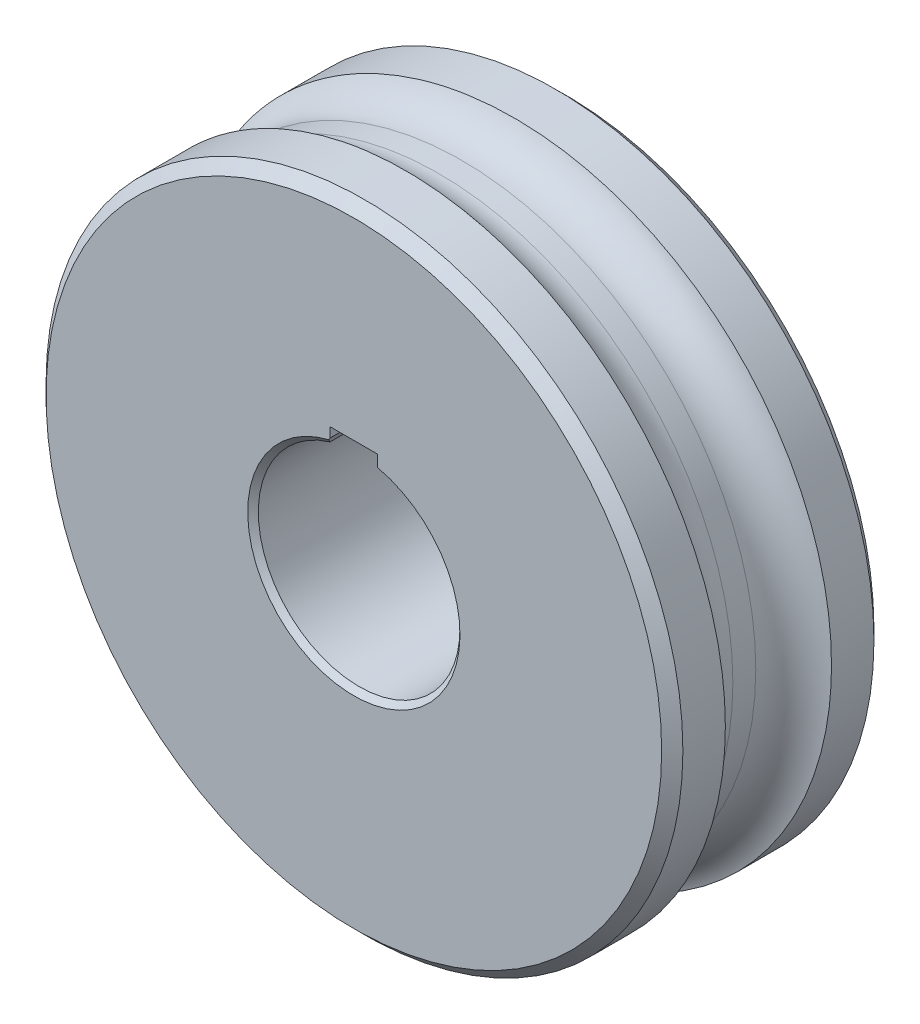
ISO-10303-21;
HEADER;
FILE_DESCRIPTION(('STEP AP214'),'2;1');
FILE_NAME('part.step','',(''),(''),'','','');
FILE_SCHEMA(('AUTOMOTIVE_DESIGN { 1 0 10303 214 1 1 1 1 }'));
ENDSEC;
DATA;
#1=APPLICATION_CONTEXT('core data for automotive mechanical design processes');
#2=APPLICATION_PROTOCOL_DEFINITION('international standard','automotive_design',2000,#1);
#3=PRODUCT_CONTEXT('',#1,'mechanical');
#4=PRODUCT('Part','Part','',(#3));
#5=PRODUCT_RELATED_PRODUCT_CATEGORY('part','',(#4));
#6=PRODUCT_DEFINITION_FORMATION('','',#4);
#7=PRODUCT_DEFINITION_CONTEXT('part definition',#1,'design');
#8=PRODUCT_DEFINITION('design','',#6,#7);
#9=PRODUCT_DEFINITION_SHAPE('','',#8);
#10=(LENGTH_UNIT() NAMED_UNIT(*) SI_UNIT(.MILLI.,.METRE.));
#11=(NAMED_UNIT(*) PLANE_ANGLE_UNIT() SI_UNIT($,.RADIAN.));
#12=(NAMED_UNIT(*) SI_UNIT($,.STERADIAN.) SOLID_ANGLE_UNIT());
#13=UNCERTAINTY_MEASURE_WITH_UNIT(LENGTH_MEASURE(1.E-05),#10,'distance_accuracy_value','');
#14=(GEOMETRIC_REPRESENTATION_CONTEXT(3) GLOBAL_UNCERTAINTY_ASSIGNED_CONTEXT((#13)) GLOBAL_UNIT_ASSIGNED_CONTEXT((#10,
#11,#12)) REPRESENTATION_CONTEXT('',''));
#15=CARTESIAN_POINT('',(0.,0.,0.));
#16=DIRECTION('',(0.,0.,1.));
#17=DIRECTION('',(1.,0.,0.));
#18=AXIS2_PLACEMENT_3D('',#15,#16,#17);
#19=CARTESIAN_POINT('',(-297.670899950721,626.415366790637,-139.445627484166));
#20=DIRECTION('',(0.,0.,1.));
#21=DIRECTION('',(1.,0.,0.));
#22=AXIS2_PLACEMENT_3D('',#19,#20,#21);
#23=CYLINDRICAL_SURFACE('',#22,59.9999999997861);
#24=CARTESIAN_POINT('',(-297.670899950721,626.415366790637,32.26));
#25=DIRECTION('',(0.,0.,1.));
#26=DIRECTION('',(1.,0.,0.));
#27=AXIS2_PLACEMENT_3D('',#24,#25,#26);
#28=CIRCLE('',#27,59.9999999997861);
#29=CARTESIAN_POINT('',(-237.670899950935,626.415366790637,32.26));
#30=VERTEX_POINT('',#29);
#31=EDGE_CURVE('E195',#30,#30,#28,.T.);
#32=ORIENTED_EDGE('',*,*,#31,.T.);
#33=EDGE_LOOP('',(#32));
#34=FACE_BOUND('',#33,.T.);
#35=CARTESIAN_POINT('',(-336.420477547887,580.606303975343,41.5272521517537));
#36=CARTESIAN_POINT('',(-335.390338737614,579.734915453957,41.5051684799978));
#37=CARTESIAN_POINT('',(-334.330806938694,578.898308766413,41.4828163092265));
#38=CARTESIAN_POINT('',(-332.70125401925,577.698537391911,41.4490363728457));
#39=CARTESIAN_POINT('',(-332.151356937595,577.30780110102,41.4377343757435));
#40=CARTESIAN_POINT('',(-331.038617325716,576.545029715684,41.415066736645));
#41=CARTESIAN_POINT('',(-330.47577276904,576.172997578115,41.4037010848993));
#42=CARTESIAN_POINT('',(-328.76848522588,575.085441406517,41.3695378593218));
#43=CARTESIAN_POINT('',(-327.605560322874,574.398657823888,41.3466796629169));
#44=CARTESIAN_POINT('',(-325.235986466903,573.105065414893,41.3009835214889));
#45=CARTESIAN_POINT('',(-324.029334894191,572.498261390387,41.2781455777633));
#46=CARTESIAN_POINT('',(-322.037956682287,571.579630264985,41.2411915939157));
#47=CARTESIAN_POINT('',(-321.264782511037,571.242548122738,41.2270179736366));
#48=CARTESIAN_POINT('',(-319.705014341062,570.601312837427,41.1987812408852));
#49=CARTESIAN_POINT('',(-318.918422550075,570.297154336461,41.1847181107784));
#50=CARTESIAN_POINT('',(-317.332945731991,569.722200320451,41.1567324552621));
#51=CARTESIAN_POINT('',(-316.534058211142,569.451411676331,41.1428099593494));
#52=CARTESIAN_POINT('',(-314.925596721631,568.943748118392,41.1151414099863));
#53=CARTESIAN_POINT('',(-314.116022296382,568.706874658725,41.1013953641243));
#54=CARTESIAN_POINT('',(-311.672676997128,568.047604036124,41.0604559653316));
#55=CARTESIAN_POINT('',(-310.02467139317,567.676697035878,41.0335681935529));
#56=CARTESIAN_POINT('',(-306.703533276097,567.075157439392,40.9808426819324));
#57=CARTESIAN_POINT('',(-305.030401682049,566.844519725079,40.9550049038112));
#58=CARTESIAN_POINT('',(-301.670921640349,566.525085333743,40.9045567373098));
#59=CARTESIAN_POINT('',(-299.984575988505,566.436259425484,40.879946096997));
#60=CARTESIAN_POINT('',(-296.61037905059,566.401017658774,40.8320893663977));
#61=CARTESIAN_POINT('',(-294.922527751608,566.454603033484,40.808843287929));
#62=CARTESIAN_POINT('',(-291.557516027334,566.703789222089,40.7638249257233));
#63=CARTESIAN_POINT('',(-289.880354373483,566.899373407962,40.7420524697519));
#64=CARTESIAN_POINT('',(-286.548458324711,567.43115378131,40.7000522379598));
#65=CARTESIAN_POINT('',(-284.893723880575,567.767349660161,40.6798244587488));
#66=CARTESIAN_POINT('',(-281.618555561482,568.577939551472,40.6409580301012));
#67=CARTESIAN_POINT('',(-279.99811940007,569.052324320404,40.6223192744817));
#68=CARTESIAN_POINT('',(-276.802957310503,570.135931921532,40.5866449817444));
#69=CARTESIAN_POINT('',(-275.228231403314,570.745154815567,40.5696094453618));
#70=CARTESIAN_POINT('',(-272.135662812471,572.094121979662,40.537132461471));
#71=CARTESIAN_POINT('',(-270.617821145544,572.833868581301,40.5216910424468));
#72=CARTESIAN_POINT('',(-267.649847158901,574.438618034869,40.492372769712));
#73=CARTESIAN_POINT('',(-266.199714829011,575.303620867973,40.4784959157663));
#74=CARTESIAN_POINT('',(-263.377620620415,577.15263779429,40.4522608007537));
#75=CARTESIAN_POINT('',(-262.005650655969,578.136639544293,40.4399023824541));
#76=CARTESIAN_POINT('',(-259.349475732921,580.216730915203,40.4166413993295));
#77=CARTESIAN_POINT('',(-258.065270769385,581.31282052981,40.4057388344228));
#78=CARTESIAN_POINT('',(-255.593760521462,583.609293951825,40.3853184729911));
#79=CARTESIAN_POINT('',(-254.406455101152,584.809677612934,40.3758006745237));
#80=CARTESIAN_POINT('',(-252.137185686356,587.306206418373,40.3580724134901));
#81=CARTESIAN_POINT('',(-251.055221690575,588.602351561526,40.3498619509078));
#82=CARTESIAN_POINT('',(-249.004372696069,591.28113181703,40.3346685501663));
#83=CARTESIAN_POINT('',(-248.035482955486,592.663763298771,40.3276855605258));
#84=CARTESIAN_POINT('',(-246.217619619523,595.505735583946,40.3148673208376));
#85=CARTESIAN_POINT('',(-245.368646020194,596.965076384855,40.309032070752));
#86=CARTESIAN_POINT('',(-243.796652408752,599.950091072501,40.2984339269994));
#87=CARTESIAN_POINT('',(-243.073632300577,601.475764908646,40.2936710325145));
#88=CARTESIAN_POINT('',(-241.758686005468,604.582599934088,40.2851491437985));
#89=CARTESIAN_POINT('',(-241.16675981884,606.163761123514,40.2813901495697));
#90=CARTESIAN_POINT('',(-240.118215211914,609.370314426313,40.2748171552226));
#91=CARTESIAN_POINT('',(-239.661595518087,610.995706123225,40.27200314621));
#92=CARTESIAN_POINT('',(-238.88690310518,614.279179141533,40.2672728490697));
#93=CARTESIAN_POINT('',(-238.568830384966,615.937260462663,40.2653565609346));
#94=CARTESIAN_POINT('',(-238.073493367225,619.274325528822,40.2623878966913));
#95=CARTESIAN_POINT('',(-237.896229133147,620.953309283271,40.2613355209724));
#96=CARTESIAN_POINT('',(-237.683769702923,624.320241921251,40.2600755257337));
#97=CARTESIAN_POINT('',(-237.64857450717,626.008190804808,40.2598679062162));
#98=CARTESIAN_POINT('',(-237.720503401451,629.381053579742,40.2602935876915));
#99=CARTESIAN_POINT('',(-237.827627506833,631.065967470792,40.2609268887748));
#100=CARTESIAN_POINT('',(-238.183433361709,634.420781350639,40.2630460501652));
#101=CARTESIAN_POINT('',(-238.432115111081,636.090681339449,40.2645319104715));
#102=CARTESIAN_POINT('',(-239.069268022492,639.403595121794,40.2683828709181));
#103=CARTESIAN_POINT('',(-239.457739159166,641.046608920205,40.2707479708989));
#104=CARTESIAN_POINT('',(-240.371708725979,644.29406977884,40.276398191295));
#105=CARTESIAN_POINT('',(-240.897207156044,645.898516839084,40.2796833117099));
#106=CARTESIAN_POINT('',(-242.08149484802,649.057437581984,40.2872269601124));
#107=CARTESIAN_POINT('',(-242.740284112084,650.611911263833,40.2914854881156));
#108=CARTESIAN_POINT('',(-244.18646917881,653.659833858136,40.3010400009439));
#109=CARTESIAN_POINT('',(-244.973864981333,655.153282770655,40.3063359857678));
#110=CARTESIAN_POINT('',(-246.671664294797,658.06853838403,40.3180377114671));
#111=CARTESIAN_POINT('',(-247.582067806487,659.490345084449,40.3244434523492));
#112=CARTESIAN_POINT('',(-249.51940892359,662.252208260078,40.3384424768131));
#113=CARTESIAN_POINT('',(-250.54634652889,663.592264735365,40.3460357603936));
#114=CARTESIAN_POINT('',(-252.709453244775,666.181100594274,40.3624900279762));
#115=CARTESIAN_POINT('',(-253.845622333965,667.429879995772,40.37135101173));
#116=CARTESIAN_POINT('',(-256.219112963788,669.827284591884,40.3904198731803));
#117=CARTESIAN_POINT('',(-257.456434503997,670.975909786916,40.4006277508713));
#118=CARTESIAN_POINT('',(-260.023431361182,673.164840922984,40.4224650646027));
#119=CARTESIAN_POINT('',(-261.353106671435,674.205146871905,40.4340945005396));
#120=CARTESIAN_POINT('',(-264.095355830794,676.170045224946,40.458841417729));
#121=CARTESIAN_POINT('',(-265.507929680625,677.094637628054,40.4719588989945));
#122=CARTESIAN_POINT('',(-268.405946409601,678.821546799307,40.4997366212108));
#123=CARTESIAN_POINT('',(-269.891390053005,679.62386228465,40.5143968783442));
#124=CARTESIAN_POINT('',(-272.924569801743,681.100504692142,40.5452989920591));
#125=CARTESIAN_POINT('',(-274.472305906972,681.774831614507,40.5615408486381));
#126=CARTESIAN_POINT('',(-277.619065192165,682.990706242801,40.5956258412935));
#127=CARTESIAN_POINT('',(-279.218088372171,683.532253948617,40.6134689773714));
#128=CARTESIAN_POINT('',(-282.456052390522,684.478724154079,40.6507534482883));
#129=CARTESIAN_POINT('',(-284.094993230371,684.883646648576,40.6701947831877));
#130=CARTESIAN_POINT('',(-287.401215071871,685.554007482414,40.7106474117194));
#131=CARTESIAN_POINT('',(-289.068497353654,685.819439503848,40.7316587764134));
#132=CARTESIAN_POINT('',(-292.419475822244,686.208909342816,40.7751924373413));
#133=CARTESIAN_POINT('',(-294.10317200937,686.332947157614,40.7977147336044));
#134=CARTESIAN_POINT('',(-297.475009860781,686.438751815856,40.8441802295121));
#135=CARTESIAN_POINT('',(-299.16315152731,686.420518587456,40.8681234298742));
#136=CARTESIAN_POINT('',(-302.531880088178,686.24191550201,40.9173066639237));
#137=CARTESIAN_POINT('',(-304.212466981945,686.0815456342,40.9425466977094));
#138=CARTESIAN_POINT('',(-307.554305378687,685.619791039846,40.9941663101762));
#139=CARTESIAN_POINT('',(-309.215554972756,685.318392510455,41.0205460001692));
#140=CARTESIAN_POINT('',(-312.506743585365,684.576722034981,41.0742459175582));
#141=CARTESIAN_POINT('',(-314.13668260197,684.136450080319,41.1015661450125));
#142=CARTESIAN_POINT('',(-317.353666767785,683.120165062926,41.1569132680182));
#143=CARTESIAN_POINT('',(-318.940711901231,682.544151950312,41.1849401638294));
#144=CARTESIAN_POINT('',(-322.060629688501,681.260480601453,41.2414301576758));
#145=CARTESIAN_POINT('',(-323.593502338309,680.552822355445,41.2698932557434));
#146=CARTESIAN_POINT('',(-326.59435398994,679.010802568479,41.3269535114664));
#147=CARTESIAN_POINT('',(-328.062325564293,678.176426573777,41.3555506840536));
#148=CARTESIAN_POINT('',(-330.922755124868,676.386960617205,41.4125382868284));
#149=CARTESIAN_POINT('',(-332.315213104064,675.431870644102,41.4409287169967));
#150=CARTESIAN_POINT('',(-335.014719206701,673.407762483595,41.4971374731274));
#151=CARTESIAN_POINT('',(-336.321767238814,672.338744174369,41.524955798478));
#152=CARTESIAN_POINT('',(-338.841159950071,670.094375750459,41.579632917506));
#153=CARTESIAN_POINT('',(-340.053504631265,668.919025638076,41.6064917112041));
#154=CARTESIAN_POINT('',(-342.374887504666,666.470326226705,41.6588481653578));
#155=CARTESIAN_POINT('',(-343.483924162075,665.196975472279,41.684345805589));
#156=CARTESIAN_POINT('',(-345.590782272501,662.561338029531,41.7335719850688));
#157=CARTESIAN_POINT('',(-346.588603720774,661.199051337415,41.7573005242418));
#158=CARTESIAN_POINT('',(-348.465931826734,658.395222817103,41.802586009785));
#159=CARTESIAN_POINT('',(-349.345438426019,656.953680949785,41.824142955083));
#160=CARTESIAN_POINT('',(-350.979875315718,654.00158980506,41.8646996269861));
#161=CARTESIAN_POINT('',(-351.734805629955,652.49104054085,41.88369935408));
#162=CARTESIAN_POINT('',(-353.114584619525,649.41196276746,41.9187822494819));
#163=CARTESIAN_POINT('',(-353.739457570809,647.843445142886,41.9348659620084));
#164=CARTESIAN_POINT('',(-354.854848795185,644.659316107692,41.9638077215857));
#165=CARTESIAN_POINT('',(-355.345367071352,643.043704698149,41.9766657687105));
#166=CARTESIAN_POINT('',(-356.188546313836,639.776906576751,41.9988971587921));
#167=CARTESIAN_POINT('',(-356.541209679916,638.125720484704,42.0082705624091));
#168=CARTESIAN_POINT('',(-357.106177226172,634.799492024466,42.0233395846539));
#169=CARTESIAN_POINT('',(-357.318481501195,633.124449672396,42.0290352057671));
#170=CARTESIAN_POINT('',(-357.60116830827,629.763013576818,42.0366278696003));
#171=CARTESIAN_POINT('',(-357.67160041093,628.076624004777,42.0385262390913));
#172=CARTESIAN_POINT('',(-357.670188986112,624.703900481741,42.0384882420264));
#173=CARTESIAN_POINT('',(-357.598345225108,623.017566530843,42.0365518691763));
#174=CARTESIAN_POINT('',(-357.312882221131,619.656789913627,42.0288849947053));
#175=CARTESIAN_POINT('',(-357.099249251165,617.982348414515,42.0231541257291));
#176=CARTESIAN_POINT('',(-356.531709275388,614.657423038535,42.0080178547962));
#177=CARTESIAN_POINT('',(-356.177803345394,613.006938978028,41.9986124810209));
#178=CARTESIAN_POINT('',(-355.332248367421,609.741619298684,41.9763213441104));
#179=CARTESIAN_POINT('',(-354.84059085971,608.126785875832,41.9634353672228));
#180=CARTESIAN_POINT('',(-353.722892674342,604.944038811823,41.9344386011697));
#181=CARTESIAN_POINT('',(-353.096847660406,603.376126686534,41.9183277079471));
#182=CARTESIAN_POINT('',(-352.060767344543,601.068695210759,41.8919892522125));
#183=CARTESIAN_POINT('',(-351.699269583944,600.307013676227,41.8828485244787));
#184=CARTESIAN_POINT('',(-350.944502943415,598.799547780111,41.8638845312272));
#185=CARTESIAN_POINT('',(-350.551235520257,598.053762691588,41.8540612970082));
#186=CARTESIAN_POINT('',(-349.733710134164,596.579581262885,41.8337797043477));
#187=CARTESIAN_POINT('',(-349.309458178502,595.85118158817,41.8233214690861));
#188=CARTESIAN_POINT('',(-348.430593831908,594.412803915703,41.8018140244754));
#189=CARTESIAN_POINT('',(-347.975976156842,593.702829154194,41.7907647123363));
#190=CARTESIAN_POINT('',(-346.732122016818,591.847606892945,41.7607666788547));
#191=CARTESIAN_POINT('',(-345.917415883291,590.719313846622,41.7413505809947));
#192=CARTESIAN_POINT('',(-344.211603492789,588.522133665454,41.7012702957898));
#193=CARTESIAN_POINT('',(-343.320501421536,587.453243281227,41.6806061768419));
#194=CARTESIAN_POINT('',(-341.930141527345,585.898668029121,41.6488528716053));
#195=CARTESIAN_POINT('',(-341.457812136531,585.388676002139,41.6381439154487));
#196=CARTESIAN_POINT('',(-340.495806021373,584.385492888441,41.6165013623766));
#197=CARTESIAN_POINT('',(-340.006132198139,583.892299018808,41.6055678031566));
#198=CARTESIAN_POINT('',(-338.511780048808,582.43862692719,41.5724683797096));
#199=CARTESIAN_POINT('',(-337.481726359101,581.5040082684,41.5500027462992));
#200=CARTESIAN_POINT('',(-336.420477547887,580.606303975343,41.5272521517537));
#201=B_SPLINE_CURVE_WITH_KNOTS('',3,(#35,#36,#37,#38,#39,#40,#41,#42,#43,#44,#45,#46,#47,#48,
#49,#50,#51,#52,#53,#54,#55,#56,#57,#58,#59,#60,#61,#62,#63,#64,#65,#66,#67,#68,#69,#70,#71,#72,
#73,#74,#75,#76,#77,#78,#79,#80,#81,#82,#83,#84,#85,#86,#87,#88,#89,#90,#91,#92,#93,#94,#95,#96,
#97,#98,#99,#100,#101,#102,#103,#104,#105,#106,#107,#108,#109,#110,#111,#112,#113,#114,#115,
#116,#117,#118,#119,#120,#121,#122,#123,#124,#125,#126,#127,#128,#129,#130,#131,#132,#133,#134,
#135,#136,#137,#138,#139,#140,#141,#142,#143,#144,#145,#146,#147,#148,#149,#150,#151,#152,#153,
#154,#155,#156,#157,#158,#159,#160,#161,#162,#163,#164,#165,#166,#167,#168,#169,#170,#171,#172,
#173,#174,#175,#176,#177,#178,#179,#180,#181,#182,#183,#184,#185,#186,#187,#188,#189,#190,#191,
#192,#193,#194,#195,#196,#197,#198,#199,#200),.UNSPECIFIED.,.T.,.F.,(4,2,2,2,2,2,2,2,2,2,2,2,2,
2,2,2,2,2,2,2,2,2,2,2,2,2,2,2,2,2,2,2,2,2,2,2,2,2,2,2,2,2,2,2,2,2,2,2,2,2,2,2,2,2,2,2,2,2,2,2,2,
2,2,2,2,2,2,2,2,2,2,2,2,2,2,2,2,2,2,2,2,2,4),(0.,4.04733716065738,6.0710311012607,
8.09504396133172,12.1440808352644,16.1933606971156,18.7234154091434,21.253057766082,
23.7832201144919,26.3134909139511,31.3752646266868,36.4368536369652,41.4973991825635,
46.5579885483559,51.617985416098,56.67797117789,61.7376185522851,66.7972682471631,
71.8570083330442,76.9167476585177,81.9759626099959,87.0351772770949,92.0943848474532,
97.1535923555716,102.212587625528,107.271582728886,112.330573973842,117.389565230609,
122.448508869765,127.507452467535,132.566398344907,137.625344236301,142.684290673261,
147.743237105834,152.802182620431,157.861128132261,162.920073725787,167.979019313899,
173.0379649329,178.096910547069,183.155855170433,188.214799772657,193.273744006625,
198.332688284837,203.391685632554,208.450682971766,213.509680315249,218.568677849353,
223.627904499572,228.687131247675,233.746360550628,238.80559023669,243.865315186479,
248.925040448807,253.984767570501,259.04449506742,264.10480012358,269.165105650603,
274.225416588573,279.285727417022,284.346113412161,289.406499623215,294.466888332192,
299.527276073497,304.586718415688,309.646160642074,314.705514790347,319.764865519748,
324.822448188266,329.880039158054,334.938119838207,339.996161726431,345.054514312096,
350.113030140078,352.641903883763,355.17066173376,357.698930603884,360.227640586481,
364.399583650675,368.571298280574,370.656528754784,372.741412075654,376.910978067632),.UNSPECIFIED.);
#202=CARTESIAN_POINT('',(-336.420477547887,580.606303975343,41.5272521517537));
#203=VERTEX_POINT('',#202);
#204=EDGE_CURVE('E152',#203,#203,#201,.T.);
#205=ORIENTED_EDGE('',*,*,#204,.F.);
#206=EDGE_LOOP('',(#205));
#207=FACE_BOUND('',#206,.T.);
#208=ADVANCED_FACE('F41',(#34,#207),#23,.T.);
#209=CARTESIAN_POINT('',(-297.670899950721,626.415366790637,68.2599999999999));
#210=DIRECTION('',(0.,0.,1.));
#211=DIRECTION('',(1.,0.,0.));
#212=AXIS2_PLACEMENT_3D('',#209,#210,#211);
#213=CIRCLE('',#212,59.9999999997861);
#214=CARTESIAN_POINT('',(-237.670899950935,626.415366790637,68.2599999999999));
#215=VERTEX_POINT('',#214);
#216=EDGE_CURVE('E207',#215,#215,#213,.F.);
#217=ORIENTED_EDGE('',*,*,#216,.T.);
#218=EDGE_LOOP('',(#217));
#219=FACE_BOUND('',#218,.T.);
#220=CARTESIAN_POINT('',(-336.420477547805,580.606303975274,58.9927478487613));
#221=CARTESIAN_POINT('',(-337.450620655545,581.477694020244,58.9706641128549));
#222=CARTESIAN_POINT('',(-338.451343481215,582.383843219325,58.9488494527151));
#223=CARTESIAN_POINT('',(-339.904735246666,583.791918516593,58.9166871732661));
#224=CARTESIAN_POINT('',(-340.381253168713,584.26942190998,58.9060596358112));
#225=CARTESIAN_POINT('',(-341.317995583324,585.240299747961,58.8850138582152));
#226=CARTESIAN_POINT('',(-341.778217494307,585.733676683789,58.8745956513479));
#227=CARTESIAN_POINT('',(-343.133849228034,587.237038711934,58.8436891836499));
#228=CARTESIAN_POINT('',(-344.003984019641,588.270021486686,58.8235544235431));
#229=CARTESIAN_POINT('',(-345.672640321216,590.392383962595,58.7844415386446));
#230=CARTESIAN_POINT('',(-346.471157543313,591.481767034388,58.7654634831286));
#231=CARTESIAN_POINT('',(-347.707178045378,593.293139196627,58.7357417956862));
#232=CARTESIAN_POINT('',(-348.167680140879,593.99953660754,58.7245813117755));
#233=CARTESIAN_POINT('',(-349.058454689644,595.431021137997,58.7028423831054));
#234=CARTESIAN_POINT('',(-349.488732058735,596.156105191955,58.692263843758));
#235=CARTESIAN_POINT('',(-350.318441994052,597.623924724379,58.6717327660234));
#236=CARTESIAN_POINT('',(-350.717868209187,598.36666379641,58.6617803566105));
#237=CARTESIAN_POINT('',(-351.485066134556,599.868301215992,58.6425497664613));
#238=CARTESIAN_POINT('',(-351.852836486955,600.627200254961,58.6332716146488));
#239=CARTESIAN_POINT('',(-352.907958653091,602.926827109907,58.6065074554249));
#240=CARTESIAN_POINT('',(-353.546919730128,604.490127506861,58.5900967658769));
#241=CARTESIAN_POINT('',(-354.690743090444,607.664763912651,58.5604746884936));
#242=CARTESIAN_POINT('',(-355.195610261368,609.2760981683,58.5472631840515));
#243=CARTESIAN_POINT('',(-356.067717102233,612.535295138227,58.5243029717873));
#244=CARTESIAN_POINT('',(-356.434987148252,614.183149705067,58.5145534997083));
#245=CARTESIAN_POINT('',(-357.029405974533,617.503956690559,58.4987148133027));
#246=CARTESIAN_POINT('',(-357.256553543724,619.176909326004,58.4926256306118));
#247=CARTESIAN_POINT('',(-357.56909446038,622.535818924729,58.4842354439176));
#248=CARTESIAN_POINT('',(-357.65450447044,624.221774335994,58.4819339946306));
#249=CARTESIAN_POINT('',(-357.683010567931,627.594883964857,58.4811665952916));
#250=CARTESIAN_POINT('',(-357.626106979565,629.282038179716,58.4827006365021));
#251=CARTESIAN_POINT('',(-357.370419042681,632.645206654404,58.4895710314839));
#252=CARTESIAN_POINT('',(-357.171663667745,634.321223118601,58.4949066087816));
#253=CARTESIAN_POINT('',(-356.633719735637,637.650549718063,58.5092672608607));
#254=CARTESIAN_POINT('',(-356.294531130546,639.30385984558,58.518292336901));
#255=CARTESIAN_POINT('',(-355.478129159959,642.576051847318,58.5398457696898));
#256=CARTESIAN_POINT('',(-355.000913267728,644.194933090699,58.5523741905706));
#257=CARTESIAN_POINT('',(-353.911856999928,647.386731962916,58.5806815556761));
#258=CARTESIAN_POINT('',(-353.300016619427,648.959649590067,58.5964605000198));
#259=CARTESIAN_POINT('',(-351.946024794897,652.048440678617,58.6309616104294));
#260=CARTESIAN_POINT('',(-351.203865450223,653.564310674709,58.649683954933));
#261=CARTESIAN_POINT('',(-349.59454118821,656.528138698331,58.6897192229543));
#262=CARTESIAN_POINT('',(-348.727376269033,657.976096724865,58.7110321465101));
#263=CARTESIAN_POINT('',(-346.87420741003,660.793819113713,58.7558658909552));
#264=CARTESIAN_POINT('',(-345.888203457121,662.16358346742,58.7793867120877));
#265=CARTESIAN_POINT('',(-343.804365260995,664.815194077266,58.8282355027713));
#266=CARTESIAN_POINT('',(-342.706530991477,666.097040312728,58.8535634727474));
#267=CARTESIAN_POINT('',(-340.406482154184,668.56409181211,58.9056276113201));
#268=CARTESIAN_POINT('',(-339.204235876039,669.74926750336,58.9323642067455));
#269=CARTESIAN_POINT('',(-336.70419549237,672.014125399242,58.9868357968544));
#270=CARTESIAN_POINT('',(-335.406401368801,673.093807583951,59.0145707917264));
#271=CARTESIAN_POINT('',(-332.724487314153,675.140010613359,59.0706502321557));
#272=CARTESIAN_POINT('',(-331.340367358789,676.106531426223,59.0989946778844));
#273=CARTESIAN_POINT('',(-328.495636352822,677.919546290983,59.1559253803929));
#274=CARTESIAN_POINT('',(-327.035025294947,678.766040331468,59.1845116371957));
#275=CARTESIAN_POINT('',(-324.047369742755,680.333155428771,59.2415917189929));
#276=CARTESIAN_POINT('',(-322.5203111205,681.053749552068,59.2700855229325));
#277=CARTESIAN_POINT('',(-319.410905260844,682.363720448904,59.3266656989654));
#278=CARTESIAN_POINT('',(-317.828558014453,682.95309720111,59.3547520709924));
#279=CARTESIAN_POINT('',(-314.619821343992,683.996441845778,59.410243274101));
#280=CARTESIAN_POINT('',(-312.993431893368,684.450409656602,59.4376481047717));
#281=CARTESIAN_POINT('',(-309.708173162731,685.219705392551,59.4915385632812));
#282=CARTESIAN_POINT('',(-308.049303884496,685.535033325267,59.5180241911704));
#283=CARTESIAN_POINT('',(-304.710876169162,686.024803818572,59.5698758256326));
#284=CARTESIAN_POINT('',(-303.031317698336,686.199246149466,59.5952418303803));
#285=CARTESIAN_POINT('',(-299.663456291359,686.405999628497,59.6446906361482));
#286=CARTESIAN_POINT('',(-297.97515335499,686.438310773095,59.6687734371365));
#287=CARTESIAN_POINT('',(-294.601809800723,686.360567236885,59.7155282100458));
#288=CARTESIAN_POINT('',(-292.916769180974,686.250512636895,59.7382001827677));
#289=CARTESIAN_POINT('',(-289.561933394195,685.888815467457,59.782039947178));
#290=CARTESIAN_POINT('',(-287.892138225749,685.637172911164,59.8032077390061));
#291=CARTESIAN_POINT('',(-284.579852687277,684.99412024758,59.8439755888847));
#292=CARTESIAN_POINT('',(-282.937359330506,684.602725535528,59.8635758193283));
#293=CARTESIAN_POINT('',(-279.69117011102,683.682942698682,59.9011792382514));
#294=CARTESIAN_POINT('',(-278.087474245861,683.154554582521,59.9191824268315));
#295=CARTESIAN_POINT('',(-274.930286724255,681.964538717991,59.9535862583359));
#296=CARTESIAN_POINT('',(-273.376795049068,681.302911019363,59.9699869018583));
#297=CARTESIAN_POINT('',(-270.331065014584,679.851117640694,60.0012032616753));
#298=CARTESIAN_POINT('',(-268.838826651784,679.060951968005,60.0160189780604));
#299=CARTESIAN_POINT('',(-265.926366415584,677.357786248926,60.0441012964378));
#300=CARTESIAN_POINT('',(-264.506137208069,676.444798746654,60.0573680563709));
#301=CARTESIAN_POINT('',(-261.747632311989,674.502416925645,60.0824074283348));
#302=CARTESIAN_POINT('',(-260.409356617753,673.473022614965,60.0941800404689));
#303=CARTESIAN_POINT('',(-257.824276688012,671.305145102073,60.1162966158832));
#304=CARTESIAN_POINT('',(-256.577472431727,670.166661924646,60.1266405794879));
#305=CARTESIAN_POINT('',(-254.184202179727,667.788700324407,60.1459739049578));
#306=CARTESIAN_POINT('',(-253.037736182403,666.549221903217,60.1549632668448));
#307=CARTESIAN_POINT('',(-250.853350801833,663.978146784342,60.1716658948136));
#308=CARTESIAN_POINT('',(-249.815425972885,662.646554713739,60.1793792249277));
#309=CARTESIAN_POINT('',(-247.855437880163,659.900663656485,60.1936105555898));
#310=CARTESIAN_POINT('',(-246.933374612012,658.486364672959,60.200128556183));
#311=CARTESIAN_POINT('',(-245.211666407977,655.585114790942,60.2120473898136));
#312=CARTESIAN_POINT('',(-244.412021459564,654.098163899887,60.2174482229652));
#313=CARTESIAN_POINT('',(-242.940835864925,651.062181575694,60.2272056859957));
#314=CARTESIAN_POINT('',(-242.269295218931,649.513150142442,60.2315623158728));
#315=CARTESIAN_POINT('',(-241.059101107982,646.364039966023,60.2392962902666));
#316=CARTESIAN_POINT('',(-240.520445934423,644.763961879496,60.2426736473747));
#317=CARTESIAN_POINT('',(-239.579841589485,641.524115063676,60.2485036690872));
#318=CARTESIAN_POINT('',(-239.177892416579,639.884346334826,60.250956333702));
#319=CARTESIAN_POINT('',(-238.513557984258,636.576775780765,60.2549790524373));
#320=CARTESIAN_POINT('',(-238.251172744193,634.908973951668,60.2565491064354));
#321=CARTESIAN_POINT('',(-237.867831870399,631.557194492025,60.25883470702));
#322=CARTESIAN_POINT('',(-237.746876237124,629.873216861427,60.2595502536037));
#323=CARTESIAN_POINT('',(-237.647254598915,626.501058122699,60.2601399702641));
#324=CARTESIAN_POINT('',(-237.668588573313,624.812877015178,60.260014140463));
#325=CARTESIAN_POINT('',(-237.85339441416,621.444313031573,60.2589187775896));
#326=CARTESIAN_POINT('',(-238.016866280436,619.763930155479,60.2579492445184));
#327=CARTESIAN_POINT('',(-238.484785510565,616.422909741151,60.2551487893581));
#328=CARTESIAN_POINT('',(-238.789232824393,614.76227219591,60.2533178675746));
#329=CARTESIAN_POINT('',(-239.536938250299,611.472547974136,60.2487622073508));
#330=CARTESIAN_POINT('',(-239.980196362309,609.843461297588,60.2460374689108));
#331=CARTESIAN_POINT('',(-241.002371747105,606.62842048891,60.2396481896688));
#332=CARTESIAN_POINT('',(-241.581289033337,605.042466361055,60.2359836487735));
#333=CARTESIAN_POINT('',(-242.870666421651,601.924966003029,60.2276568798219));
#334=CARTESIAN_POINT('',(-243.581126523671,600.393419772831,60.2229946517659));
#335=CARTESIAN_POINT('',(-245.128538197293,597.39562282107,60.2126048767182));
#336=CARTESIAN_POINT('',(-245.965489830405,595.929372131258,60.2068773292084));
#337=CARTESIAN_POINT('',(-247.759933058015,593.072591113711,60.1942820822828));
#338=CARTESIAN_POINT('',(-248.717424652357,591.682060785877,60.1874143828686));
#339=CARTESIAN_POINT('',(-250.746137918978,588.986607924933,60.1724597316973));
#340=CARTESIAN_POINT('',(-251.817359435455,587.68168527455,60.1643727816106));
#341=CARTESIAN_POINT('',(-254.065916316605,585.166722403362,60.1468994285588));
#342=CARTESIAN_POINT('',(-255.243251680933,583.956682182247,60.1375130255979));
#343=CARTESIAN_POINT('',(-257.695665679124,581.640084684404,60.1173629326121));
#344=CARTESIAN_POINT('',(-258.970744423521,580.533527524705,60.1065992410297));
#345=CARTESIAN_POINT('',(-261.609576907429,578.431763417379,60.0836227127477));
#346=CARTESIAN_POINT('',(-262.973330646773,577.436556469547,60.0714098760507));
#347=CARTESIAN_POINT('',(-265.779836322577,575.564552429807,60.045472668141));
#348=CARTESIAN_POINT('',(-267.222589430605,574.687757094624,60.0317482745087));
#349=CARTESIAN_POINT('',(-270.176815926035,573.058824901781,60.0027392816567));
#350=CARTESIAN_POINT('',(-271.68828931923,572.306688054629,59.9874546823056));
#351=CARTESIAN_POINT('',(-274.769184293113,570.932427949575,59.9552938037244));
#352=CARTESIAN_POINT('',(-276.338604970651,570.310302666354,59.9384175492951));
#353=CARTESIAN_POINT('',(-279.524257020821,569.200470354575,59.9030621081241));
#354=CARTESIAN_POINT('',(-281.140488373376,568.712763268365,59.8845829220699));
#355=CARTESIAN_POINT('',(-284.408268044205,567.875230497186,59.8460347070714));
#356=CARTESIAN_POINT('',(-286.059816302758,567.525404579076,59.8259656808153));
#357=CARTESIAN_POINT('',(-289.386495595219,566.966115057702,59.784278048221));
#358=CARTESIAN_POINT('',(-291.061626673261,566.756651717154,59.7626594389824));
#359=CARTESIAN_POINT('',(-294.423719741456,566.479557221059,59.7179411466108));
#360=CARTESIAN_POINT('',(-296.110682870943,566.411939917655,59.6948413190546));
#361=CARTESIAN_POINT('',(-299.484292140116,566.419060737817,59.6472656213475));
#362=CARTESIAN_POINT('',(-301.170938282113,566.49379777977,59.622789761653));
#363=CARTESIAN_POINT('',(-304.532288868,566.785102583922,59.572594917228));
#364=CARTESIAN_POINT('',(-306.206990176889,567.001706288688,59.5468756189964));
#365=CARTESIAN_POINT('',(-309.532443651721,567.575331663211,59.4943682446998));
#366=CARTESIAN_POINT('',(-311.183195040313,567.932357880188,59.4675801340493));
#367=CARTESIAN_POINT('',(-313.631608115038,568.571025860486,59.4267718576727));
#368=CARTESIAN_POINT('',(-314.44306647808,568.801081997108,59.4130658074797));
#369=CARTESIAN_POINT('',(-316.055579833504,569.295192286112,59.3854711079999));
#370=CARTESIAN_POINT('',(-316.856635301655,569.559244877617,59.3715824671227));
#371=CARTESIAN_POINT('',(-318.446740930239,570.120826235026,59.3436576828202));
#372=CARTESIAN_POINT('',(-319.235793382506,570.418348516845,59.3296215684412));
#373=CARTESIAN_POINT('',(-320.800768514033,571.046419661375,59.3014316573745));
#374=CARTESIAN_POINT('',(-321.576688874871,571.376974286145,59.2872778405513));
#375=CARTESIAN_POINT('',(-323.613973226409,572.296114582935,59.2496562430547));
#376=CARTESIAN_POINT('',(-324.862827280129,572.912688268704,59.2261182275429));
#377=CARTESIAN_POINT('',(-327.314578036302,574.231177835956,59.1790037065952));
#378=CARTESIAN_POINT('',(-328.51747725477,574.933089036409,59.1554272033403));
#379=CARTESIAN_POINT('',(-330.282602199412,576.047113021033,59.1201859918725));
#380=CARTESIAN_POINT('',(-330.864355269931,576.428585207364,59.1084612670906));
#381=CARTESIAN_POINT('',(-332.014153048546,577.211458205415,59.0850772723637));
#382=CARTESIAN_POINT('',(-332.582200025141,577.612855685204,59.0734179918356));
#383=CARTESIAN_POINT('',(-334.264962740441,578.846376696051,59.0385723659761));
#384=CARTESIAN_POINT('',(-335.35835769611,579.707865051227,59.015517087452));
#385=CARTESIAN_POINT('',(-336.420477547805,580.606303975274,58.9927478487613));
#386=B_SPLINE_CURVE_WITH_KNOTS('',3,(#220,#221,#222,#223,#224,#225,#226,#227,#228,#229,#230,
#231,#232,#233,#234,#235,#236,#237,#238,#239,#240,#241,#242,#243,#244,#245,#246,#247,#248,#249,
#250,#251,#252,#253,#254,#255,#256,#257,#258,#259,#260,#261,#262,#263,#264,#265,#266,#267,#268,
#269,#270,#271,#272,#273,#274,#275,#276,#277,#278,#279,#280,#281,#282,#283,#284,#285,#286,#287,
#288,#289,#290,#291,#292,#293,#294,#295,#296,#297,#298,#299,#300,#301,#302,#303,#304,#305,#306,
#307,#308,#309,#310,#311,#312,#313,#314,#315,#316,#317,#318,#319,#320,#321,#322,#323,#324,#325,
#326,#327,#328,#329,#330,#331,#332,#333,#334,#335,#336,#337,#338,#339,#340,#341,#342,#343,#344,
#345,#346,#347,#348,#349,#350,#351,#352,#353,#354,#355,#356,#357,#358,#359,#360,#361,#362,#363,
#364,#365,#366,#367,#368,#369,#370,#371,#372,#373,#374,#375,#376,#377,#378,#379,#380,#381,#382,
#383,#384,#385),.UNSPECIFIED.,.T.,.F.,(4,2,2,2,2,2,2,2,2,2,2,2,2,2,2,2,2,2,2,2,2,2,2,2,2,2,2,2,
2,2,2,2,2,2,2,2,2,2,2,2,2,2,2,2,2,2,2,2,2,2,2,2,2,2,2,2,2,2,2,2,2,2,2,2,2,2,2,2,2,2,2,2,2,2,2,2,
2,2,2,2,2,2,4),(0.,4.04734914703464,6.071048270755,8.09506656352247,12.1441080279276,
16.1933917540913,18.7226651864643,21.2515262943058,23.7809066194975,26.3103953849355,
31.3705998326667,36.4306198135738,41.4895220803186,46.5484680702234,51.606819290857,
56.6651589881108,61.7224658024567,66.7797743424801,71.837175467783,76.8945767783954,
81.9522848020951,87.0099929001131,92.0677015549348,97.1254113993224,102.184662699478,
107.243914955101,112.303168633959,117.362422793821,122.422757948294,127.483093925485,
132.543432953554,137.603771704591,142.664118705867,147.724465833143,152.784810087769,
157.845153872251,162.904940376047,167.964726561038,173.024510857191,178.084294863968,
183.143562493443,188.202829772761,193.262095902637,198.321361951273,203.380374045619,
208.439385948837,213.498397334355,218.557408729086,223.616355073131,228.675301360659,
233.734248349548,238.793195354657,243.852141624977,248.911087889191,253.970032358275,
259.028976824947,264.087921793042,269.146866758755,274.205814184569,279.264761603866,
284.323702092803,289.382642565246,294.441588758759,299.500534942867,304.559556172005,
309.618577827645,314.6775206681,319.736461338763,324.795393455296,329.85433504066,
334.913770639977,339.973167797613,345.033847272697,350.094690638293,352.624729629277,
355.154652500238,357.684086090474,360.213961680002,364.389328805563,368.564467002401,
370.651408076721,372.738001338197,376.910984531994),.UNSPECIFIED.);
#387=CARTESIAN_POINT('',(-336.420477547805,580.606303975274,58.9927478487613));
#388=VERTEX_POINT('',#387);
#389=EDGE_CURVE('E144',#388,#388,#386,.T.);
#390=ORIENTED_EDGE('',*,*,#389,.F.);
#391=EDGE_LOOP('',(#390));
#392=FACE_BOUND('',#391,.T.);
#393=ADVANCED_FACE('F158',(#219,#392),#23,.T.);
#394=CARTESIAN_POINT('',(-297.670899950721,626.415366790637,70.26));
#395=DIRECTION('',(0.,0.,1.));
#396=DIRECTION('',(1.,0.,0.));
#397=AXIS2_PLACEMENT_3D('',#394,#395,#396);
#398=PLANE('',#397);
#399=DIRECTION('',(0.,-1.,0.));
#400=VECTOR('',#399,1.);
#401=CARTESIAN_POINT('',(-293.170899950721,0.,70.26));
#402=LINE('',#401,#400);
#403=CARTESIAN_POINT('',(-293.170899950721,648.095366790637,70.26));
#404=VERTEX_POINT('',#403);
#405=CARTESIAN_POINT('',(-293.170899950721,645.902542060542,70.26));
#406=VERTEX_POINT('',#405);
#407=EDGE_CURVE('E126',#404,#406,#402,.T.);
#408=ORIENTED_EDGE('',*,*,#407,.T.);
#409=CARTESIAN_POINT('',(-297.670899950721,626.415366790637,70.26));
#410=DIRECTION('',(0.,0.,1.));
#411=DIRECTION('',(1.,0.,0.));
#412=AXIS2_PLACEMENT_3D('',#409,#410,#411);
#413=CIRCLE('',#412,20.);
#414=CARTESIAN_POINT('',(-302.407742055984,645.846329887453,70.26));
#415=VERTEX_POINT('',#414);
#416=EDGE_CURVE('E56',#406,#415,#413,.F.);
#417=ORIENTED_EDGE('',*,*,#416,.T.);
#418=DIRECTION('',(-0.519515629835062,-0.854460947239298,0.));
#419=VECTOR('',#418,1.);
#420=CARTESIAN_POINT('',(-309.75480255176,633.762427286412,70.26));
#421=LINE('',#420,#419);
#422=CARTESIAN_POINT('',(-302.170899950721,646.235870293915,70.26));
#423=VERTEX_POINT('',#422);
#424=EDGE_CURVE('E68',#415,#423,#421,.F.);
#425=ORIENTED_EDGE('',*,*,#424,.T.);
#426=DIRECTION('',(0.,1.,0.));
#427=VECTOR('',#426,1.);
#428=CARTESIAN_POINT('',(-302.170899950721,0.,70.26));
#429=LINE('',#428,#427);
#430=CARTESIAN_POINT('',(-302.170899950721,648.095366790637,70.26));
#431=VERTEX_POINT('',#430);
#432=EDGE_CURVE('E133',#423,#431,#429,.T.);
#433=ORIENTED_EDGE('',*,*,#432,.T.);
#434=DIRECTION('',(-1.,0.,0.));
#435=VECTOR('',#434,1.);
#436=CARTESIAN_POINT('',(0.,648.095366790637,70.26));
#437=LINE('',#436,#435);
#438=EDGE_CURVE('E118',#404,#431,#437,.T.);
#439=ORIENTED_EDGE('',*,*,#438,.F.);
#440=EDGE_LOOP('',(#408,#417,#425,#433,#439));
#441=FACE_BOUND('',#440,.T.);
#442=CARTESIAN_POINT('',(-297.670899950721,626.415366790637,70.26));
#443=DIRECTION('',(0.,0.,1.));
#444=DIRECTION('',(1.,0.,0.));
#445=AXIS2_PLACEMENT_3D('',#442,#443,#444);
#446=CIRCLE('',#445,57.9999999997861);
#447=CARTESIAN_POINT('',(-239.670899950935,626.415366790637,70.26));
#448=VERTEX_POINT('',#447);
#449=EDGE_CURVE('E202',#448,#448,#446,.T.);
#450=ORIENTED_EDGE('',*,*,#449,.T.);
#451=EDGE_LOOP('',(#450));
#452=FACE_BOUND('',#451,.T.);
#453=ADVANCED_FACE('F131',(#441,#452),#398,.T.);
#454=CARTESIAN_POINT('',(105.593709746925,-523.178523142196,30.26));
#455=DIRECTION('',(0.,0.,1.));
#456=DIRECTION('',(1.,0.,0.));
#457=AXIS2_PLACEMENT_3D('',#454,#455,#456);
#458=PLANE('',#457);
#459=DIRECTION('',(0.519515629835062,0.854460947239298,0.));
#460=VECTOR('',#459,1.);
#461=CARTESIAN_POINT('',(-302.170899950721,646.235870293915,30.26));
#462=LINE('',#461,#460);
#463=CARTESIAN_POINT('',(-302.170899950721,646.235870293915,30.26));
#464=VERTEX_POINT('',#463);
#465=CARTESIAN_POINT('',(-302.407742055984,645.846329887453,30.26));
#466=VERTEX_POINT('',#465);
#467=EDGE_CURVE('E216',#464,#466,#462,.F.);
#468=ORIENTED_EDGE('',*,*,#467,.T.);
#469=CARTESIAN_POINT('',(-297.670899950721,626.415366790637,30.26));
#470=DIRECTION('',(0.,0.,1.));
#471=DIRECTION('',(1.,0.,0.));
#472=AXIS2_PLACEMENT_3D('',#469,#470,#471);
#473=CIRCLE('',#472,20.0000000000001);
#474=CARTESIAN_POINT('',(-293.170899950721,645.902542060542,30.26));
#475=VERTEX_POINT('',#474);
#476=EDGE_CURVE('E218',#466,#475,#473,.T.);
#477=ORIENTED_EDGE('',*,*,#476,.T.);
#478=DIRECTION('',(0.,1.,0.));
#479=VECTOR('',#478,1.);
#480=CARTESIAN_POINT('',(-293.170899950721,-523.178523142196,30.26));
#481=LINE('',#480,#479);
#482=CARTESIAN_POINT('',(-293.170899950721,648.095366790637,30.26));
#483=VERTEX_POINT('',#482);
#484=EDGE_CURVE('E214',#475,#483,#481,.T.);
#485=ORIENTED_EDGE('',*,*,#484,.T.);
#486=DIRECTION('',(1.,0.,0.));
#487=VECTOR('',#486,1.);
#488=CARTESIAN_POINT('',(105.593709746925,648.095366790637,30.26));
#489=LINE('',#488,#487);
#490=CARTESIAN_POINT('',(-302.170899950721,648.095366790637,30.26));
#491=VERTEX_POINT('',#490);
#492=EDGE_CURVE('E120',#491,#483,#489,.T.);
#493=ORIENTED_EDGE('',*,*,#492,.F.);
#494=DIRECTION('',(0.,-1.,0.));
#495=VECTOR('',#494,1.);
#496=CARTESIAN_POINT('',(-302.170899950721,-523.178523142196,30.26));
#497=LINE('',#496,#495);
#498=EDGE_CURVE('E210',#491,#464,#497,.T.);
#499=ORIENTED_EDGE('',*,*,#498,.T.);
#500=EDGE_LOOP('',(#468,#477,#485,#493,#499));
#501=FACE_BOUND('',#500,.T.);
#502=CARTESIAN_POINT('',(-297.670899950721,626.415366790637,30.26));
#503=DIRECTION('',(0.,0.,1.));
#504=DIRECTION('',(1.,0.,0.));
#505=AXIS2_PLACEMENT_3D('',#502,#503,#504);
#506=CIRCLE('',#505,57.9999999997861);
#507=CARTESIAN_POINT('',(-239.670899950935,626.415366790637,30.26));
#508=VERTEX_POINT('',#507);
#509=EDGE_CURVE('E198',#508,#508,#506,.F.);
#510=ORIENTED_EDGE('',*,*,#509,.T.);
#511=EDGE_LOOP('',(#510));
#512=FACE_BOUND('',#511,.T.);
#513=ADVANCED_FACE('F178',(#501,#512),#458,.F.);
#514=CARTESIAN_POINT('',(-299.491656028007,626.415366790637,48.1033100725108));
#515=DIRECTION('',(0.,0.,1.));
#516=DIRECTION('',(1.,0.,0.));
#517=AXIS2_PLACEMENT_3D('',#514,#515,#516);
#518=TOROIDAL_SURFACE('',#517,63.3963473859573,8.00000001352355);
#519=ORIENTED_EDGE('',*,*,#204,.T.);
#520=EDGE_LOOP('',(#519));
#521=FACE_BOUND('',#520,.T.);
#522=CARTESIAN_POINT('',(-299.491656028007,626.415366790637,48.1033100589607));
#523=DIRECTION('',(0.,0.,1.));
#524=DIRECTION('',(1.,0.,0.));
#525=AXIS2_PLACEMENT_3D('',#522,#523,#524);
#526=CIRCLE('',#525,55.3963473724337);
#527=CARTESIAN_POINT('',(-244.095308655573,626.415366790637,48.1033100589607));
#528=VERTEX_POINT('',#527);
#529=EDGE_CURVE('E141',#528,#528,#526,.T.);
#530=ORIENTED_EDGE('',*,*,#529,.F.);
#531=EDGE_LOOP('',(#530));
#532=FACE_BOUND('',#531,.T.);
#533=ADVANCED_FACE('F173',(#521,#532),#518,.F.);
#534=CARTESIAN_POINT('',(-299.491656028007,626.415366790637,70.26));
#535=DIRECTION('',(0.,0.,1.));
#536=DIRECTION('',(1.,0.,0.));
#537=AXIS2_PLACEMENT_3D('',#534,#535,#536);
#538=CYLINDRICAL_SURFACE('',#537,55.3963473725241);
#539=CARTESIAN_POINT('',(-299.491656028007,626.415366790637,52.4166899816907));
#540=DIRECTION('',(0.,0.,1.));
#541=DIRECTION('',(1.,0.,0.));
#542=AXIS2_PLACEMENT_3D('',#539,#540,#541);
#543=CIRCLE('',#542,55.3963473726146);
#544=CARTESIAN_POINT('',(-244.095308655392,626.415366790637,52.4166899816907));
#545=VERTEX_POINT('',#544);
#546=EDGE_CURVE('E123',#545,#545,#543,.T.);
#547=ORIENTED_EDGE('',*,*,#546,.F.);
#548=EDGE_LOOP('',(#547));
#549=FACE_BOUND('',#548,.T.);
#550=ORIENTED_EDGE('',*,*,#529,.T.);
#551=EDGE_LOOP('',(#550));
#552=FACE_BOUND('',#551,.T.);
#553=ADVANCED_FACE('F168',(#549,#552),#538,.T.);
#554=CARTESIAN_POINT('',(-299.491656028007,626.415366790637,52.4166899282215));
#555=DIRECTION('',(0.,0.,1.));
#556=DIRECTION('',(1.,0.,0.));
#557=AXIS2_PLACEMENT_3D('',#554,#555,#556);
#558=TOROIDAL_SURFACE('',#557,63.3963473859592,8.00000001334461);
#559=ORIENTED_EDGE('',*,*,#389,.T.);
#560=EDGE_LOOP('',(#559));
#561=FACE_BOUND('',#560,.T.);
#562=ORIENTED_EDGE('',*,*,#546,.T.);
#563=EDGE_LOOP('',(#562));
#564=FACE_BOUND('',#563,.T.);
#565=ADVANCED_FACE('F162',(#561,#564),#558,.F.);
#566=CARTESIAN_POINT('',(-297.670899950721,626.415366790637,30.26));
#567=DIRECTION('',(0.,0.,1.));
#568=DIRECTION('',(1.,0.,0.));
#569=AXIS2_PLACEMENT_3D('',#566,#567,#568);
#570=CONICAL_SURFACE('',#569,57.9999999997861,0.785398163397447);
#571=ORIENTED_EDGE('',*,*,#31,.F.);
#572=EDGE_LOOP('',(#571));
#573=FACE_BOUND('',#572,.T.);
#574=ORIENTED_EDGE('',*,*,#509,.F.);
#575=EDGE_LOOP('',(#574));
#576=FACE_BOUND('',#575,.T.);
#577=ADVANCED_FACE('F167',(#573,#576),#570,.T.);
#578=CARTESIAN_POINT('',(-297.670899950721,626.415366790637,70.26));
#579=DIRECTION('',(0.,0.,-1.));
#580=DIRECTION('',(-1.,0.,0.));
#581=AXIS2_PLACEMENT_3D('',#578,#579,#580);
#582=CONICAL_SURFACE('',#581,57.9999999997861,0.785398163397447);
#583=ORIENTED_EDGE('',*,*,#216,.F.);
#584=EDGE_LOOP('',(#583));
#585=FACE_BOUND('',#584,.T.);
#586=ORIENTED_EDGE('',*,*,#449,.F.);
#587=EDGE_LOOP('',(#586));
#588=FACE_BOUND('',#587,.T.);
#589=ADVANCED_FACE('F370',(#585,#588),#582,.T.);
#590=CARTESIAN_POINT('',(-297.670899950721,626.415366790637,70.26));
#591=DIRECTION('',(0.,0.,-1.));
#592=DIRECTION('',(-1.,0.,0.));
#593=AXIS2_PLACEMENT_3D('',#590,#591,#592);
#594=CYLINDRICAL_SURFACE('',#593,19.);
#595=DIRECTION('',(0.,0.,-1.));
#596=VECTOR('',#595,1.);
#597=CARTESIAN_POINT('',(-291.772854169566,644.476735951456,70.26));
#598=LINE('',#597,#596);
#599=CARTESIAN_POINT('',(-291.772854169566,644.476735951456,69.2599999999999));
#600=VERTEX_POINT('',#599);
#601=CARTESIAN_POINT('',(-291.772854169566,644.476735951456,31.26));
#602=VERTEX_POINT('',#601);
#603=EDGE_CURVE('E291',#600,#602,#598,.T.);
#604=ORIENTED_EDGE('',*,*,#603,.T.);
#605=CARTESIAN_POINT('',(-297.670899950721,626.415366790637,31.26));
#606=DIRECTION('',(0.,0.,1.));
#607=DIRECTION('',(1.,0.,0.));
#608=AXIS2_PLACEMENT_3D('',#605,#606,#607);
#609=CIRCLE('',#608,19.);
#610=CARTESIAN_POINT('',(-303.162888199122,644.604321270745,31.26));
#611=VERTEX_POINT('',#610);
#612=EDGE_CURVE('E292',#602,#611,#609,.F.);
#613=ORIENTED_EDGE('',*,*,#612,.T.);
#614=DIRECTION('',(0.,0.,-1.));
#615=VECTOR('',#614,1.);
#616=CARTESIAN_POINT('',(-303.162888199122,644.604321270745,70.26));
#617=LINE('',#616,#615);
#618=CARTESIAN_POINT('',(-303.162888199122,644.604321270745,69.2599999999999));
#619=VERTEX_POINT('',#618);
#620=EDGE_CURVE('E240',#611,#619,#617,.F.);
#621=ORIENTED_EDGE('',*,*,#620,.T.);
#622=CARTESIAN_POINT('',(-297.670899950721,626.415366790637,69.2599999999999));
#623=DIRECTION('',(0.,0.,1.));
#624=DIRECTION('',(1.,0.,0.));
#625=AXIS2_PLACEMENT_3D('',#622,#623,#624);
#626=CIRCLE('',#625,19.);
#627=EDGE_CURVE('E289',#619,#600,#626,.T.);
#628=ORIENTED_EDGE('',*,*,#627,.T.);
#629=EDGE_LOOP('',(#604,#613,#621,#628));
#630=FACE_BOUND('',#629,.T.);
#631=ADVANCED_FACE('F170',(#630),#594,.F.);
#632=CARTESIAN_POINT('',(-293.170899950721,0.,70.26));
#633=DIRECTION('',(1.,0.,0.));
#634=DIRECTION('',(0.,0.,-1.));
#635=AXIS2_PLACEMENT_3D('',#632,#633,#634);
#636=PLANE('',#635);
#637=ORIENTED_EDGE('',*,*,#484,.F.);
#638=CARTESIAN_POINT('',(-293.170899950721,645.902542060542,30.26));
#639=CARTESIAN_POINT('',(-293.170899950721,645.897915420636,30.264508007251));
#640=CARTESIAN_POINT('',(-293.170899950721,645.893288740022,30.2690159727215));
#641=CARTESIAN_POINT('',(-293.170899950721,645.884035297379,30.2780318201014));
#642=CARTESIAN_POINT('',(-293.170899950721,645.879408535349,30.2825397020108));
#643=CARTESIAN_POINT('',(-293.170899950721,645.874781732612,30.2870475421396));
#644=B_SPLINE_CURVE_WITH_KNOTS('',3,(#638,#639,#640,#641,#642,#643),.UNSPECIFIED.,.F.,.F.,(4,2,
4),(0.,0.0193791469285575,0.0387582938571932),.UNSPECIFIED.);
#645=CARTESIAN_POINT('',(-293.170899950721,645.874781732612,30.2870475421396));
#646=VERTEX_POINT('',#645);
#647=EDGE_CURVE('E233',#475,#646,#644,.T.);
#648=ORIENTED_EDGE('',*,*,#647,.T.);
#649=DIRECTION('',(0.,0.,1.));
#650=VECTOR('',#649,1.);
#651=CARTESIAN_POINT('',(-293.170899950721,645.874781732612,70.26));
#652=LINE('',#651,#650);
#653=CARTESIAN_POINT('',(-293.170899950721,645.874781732612,70.2329524578603));
#654=VERTEX_POINT('',#653);
#655=EDGE_CURVE('E227',#646,#654,#652,.T.);
#656=ORIENTED_EDGE('',*,*,#655,.T.);
#657=CARTESIAN_POINT('',(-293.170899950721,645.874781732612,70.2329524578603));
#658=CARTESIAN_POINT('',(-293.170899950721,645.879408535349,70.2374602979891));
#659=CARTESIAN_POINT('',(-293.170899950721,645.884035297379,70.2419681798985));
#660=CARTESIAN_POINT('',(-293.170899950721,645.893288740022,70.2509840272784));
#661=CARTESIAN_POINT('',(-293.170899950721,645.897915420636,70.2554919927489));
#662=CARTESIAN_POINT('',(-293.170899950721,645.902542060542,70.2599999999999));
#663=B_SPLINE_CURVE_WITH_KNOTS('',3,(#657,#658,#659,#660,#661,#662),.UNSPECIFIED.,.F.,.F.,(4,2,
4),(0.,0.0193791469285586,0.0387582938571113),.UNSPECIFIED.);
#664=EDGE_CURVE('E129',#654,#406,#663,.T.);
#665=ORIENTED_EDGE('',*,*,#664,.T.);
#666=ORIENTED_EDGE('',*,*,#407,.F.);
#667=DIRECTION('',(0.,0.,-1.));
#668=VECTOR('',#667,1.);
#669=CARTESIAN_POINT('',(-293.170899950721,648.095366790637,70.26));
#670=LINE('',#669,#668);
#671=EDGE_CURVE('E113',#404,#483,#670,.T.);
#672=ORIENTED_EDGE('',*,*,#671,.T.);
#673=EDGE_LOOP('',(#637,#648,#656,#665,#666,#672));
#674=FACE_BOUND('',#673,.T.);
#675=ADVANCED_FACE('F127',(#674),#636,.F.);
#676=CARTESIAN_POINT('',(0.,648.095366790637,70.26));
#677=DIRECTION('',(0.,-1.,0.));
#678=DIRECTION('',(0.,0.,-1.));
#679=AXIS2_PLACEMENT_3D('',#676,#677,#678);
#680=PLANE('',#679);
#681=ORIENTED_EDGE('',*,*,#492,.T.);
#682=ORIENTED_EDGE('',*,*,#671,.F.);
#683=ORIENTED_EDGE('',*,*,#438,.T.);
#684=DIRECTION('',(0.,0.,-1.));
#685=VECTOR('',#684,1.);
#686=CARTESIAN_POINT('',(-302.170899950721,648.095366790637,70.26));
#687=LINE('',#686,#685);
#688=EDGE_CURVE('E124',#431,#491,#687,.T.);
#689=ORIENTED_EDGE('',*,*,#688,.T.);
#690=EDGE_LOOP('',(#681,#682,#683,#689));
#691=FACE_BOUND('',#690,.T.);
#692=ADVANCED_FACE('F115',(#691),#680,.T.);
#693=CARTESIAN_POINT('',(-302.170899950721,0.,70.26));
#694=DIRECTION('',(-1.,0.,0.));
#695=DIRECTION('',(0.,0.,1.));
#696=AXIS2_PLACEMENT_3D('',#693,#694,#695);
#697=PLANE('',#696);
#698=ORIENTED_EDGE('',*,*,#432,.F.);
#699=DIRECTION('',(0.,0.,-1.));
#700=VECTOR('',#699,1.);
#701=CARTESIAN_POINT('',(-302.170899950721,646.235870293915,70.26));
#702=LINE('',#701,#700);
#703=EDGE_CURVE('E11',#423,#464,#702,.T.);
#704=ORIENTED_EDGE('',*,*,#703,.T.);
#705=ORIENTED_EDGE('',*,*,#498,.F.);
#706=ORIENTED_EDGE('',*,*,#688,.F.);
#707=EDGE_LOOP('',(#698,#704,#705,#706));
#708=FACE_BOUND('',#707,.T.);
#709=ADVANCED_FACE('F303',(#708),#697,.F.);
#710=CARTESIAN_POINT('',(-297.670899950721,626.415366790637,70.26));
#711=DIRECTION('',(0.,0.,1.));
#712=DIRECTION('',(1.,0.,0.));
#713=AXIS2_PLACEMENT_3D('',#710,#711,#712);
#714=CONICAL_SURFACE('',#713,20.,0.785398163397426);
#715=CARTESIAN_POINT('',(-293.170899950721,645.874781732612,70.2329524578603));
#716=CARTESIAN_POINT('',(-293.056122282225,645.760004064116,70.146987564655));
#717=CARTESIAN_POINT('',(-292.940927720579,645.64480950247,70.062130768559));
#718=CARTESIAN_POINT('',(-292.709705244362,645.413587026253,69.8948180356103));
#719=CARTESIAN_POINT('',(-292.593677536106,645.297559317997,69.8123615282994));
#720=CARTESIAN_POINT('',(-292.360731980745,645.064613762636,69.64999112143));
#721=CARTESIAN_POINT('',(-292.243814116594,644.947695898485,69.5700772707098));
#722=CARTESIAN_POINT('',(-292.009038405715,644.712920187606,69.4129569213966));
#723=CARTESIAN_POINT('',(-291.891180340381,644.595062122272,69.3357510763761));
#724=CARTESIAN_POINT('',(-291.772854169566,644.476735951456,69.2599999999999));
#725=B_SPLINE_CURVE_WITH_KNOTS('',3,(#715,#716,#717,#718,#719,#720,#721,#722,#723,#724),
.UNSPECIFIED.,.F.,.F.,(4,2,2,2,4),(0.,0.551034664349242,1.10193728127261,1.65285047336524,
2.20389572514348),.UNSPECIFIED.);
#726=EDGE_CURVE('E271',#600,#654,#725,.F.);
#727=ORIENTED_EDGE('',*,*,#726,.F.);
#728=ORIENTED_EDGE('',*,*,#627,.F.);
#729=CARTESIAN_POINT('',(-302.407742055984,645.846329887453,70.26));
#730=CARTESIAN_POINT('',(-302.470111478751,645.743749266206,70.1751103019513));
#731=CARTESIAN_POINT('',(-302.532613098524,645.640951217084,70.0905799320511));
#732=CARTESIAN_POINT('',(-302.657889828725,645.434905301606,69.9222849904286));
#733=CARTESIAN_POINT('',(-302.720664926886,645.331657455425,69.8385203848691));
#734=CARTESIAN_POINT('',(-302.846503463339,645.124687522508,69.6717962809873));
#735=CARTESIAN_POINT('',(-302.90956690262,645.020965434143,69.5888367854322));
#736=CARTESIAN_POINT('',(-303.035997373336,644.813021931458,69.4237678229071));
#737=CARTESIAN_POINT('',(-303.099364418128,644.708800495168,69.3416583938485));
#738=CARTESIAN_POINT('',(-303.162888199122,644.604321270745,69.2599999999999));
#739=B_SPLINE_CURVE_WITH_KNOTS('',3,(#729,#730,#731,#732,#733,#734,#735,#736,#737,#738),
.UNSPECIFIED.,.F.,.F.,(4,2,2,2,4),(0.,0.441101710157255,0.882183834106315,1.32326747350423,
1.76437070042478),.UNSPECIFIED.);
#740=EDGE_CURVE('E47',#415,#619,#739,.T.);
#741=ORIENTED_EDGE('',*,*,#740,.F.);
#742=ORIENTED_EDGE('',*,*,#416,.F.);
#743=ORIENTED_EDGE('',*,*,#664,.F.);
#744=EDGE_LOOP('',(#727,#728,#741,#742,#743));
#745=FACE_BOUND('',#744,.T.);
#746=ADVANCED_FACE('F44',(#745),#714,.F.);
#747=CARTESIAN_POINT('',(-302.170899950721,646.235870293915,70.26));
#748=DIRECTION('',(-0.854460947239298,0.519515629835062,0.));
#749=DIRECTION('',(0.,0.,-1.));
#750=AXIS2_PLACEMENT_3D('',#747,#748,#749);
#751=PLANE('',#750);
#752=ORIENTED_EDGE('',*,*,#740,.T.);
#753=ORIENTED_EDGE('',*,*,#620,.F.);
#754=CARTESIAN_POINT('',(-303.162888199122,644.604321270745,31.26));
#755=CARTESIAN_POINT('',(-303.099364418127,644.708800495168,31.1783416061513));
#756=CARTESIAN_POINT('',(-303.035997373336,644.813021931458,31.0962321770927));
#757=CARTESIAN_POINT('',(-302.90956690262,645.020965434143,30.9311632145676));
#758=CARTESIAN_POINT('',(-302.846503463338,645.124687522508,30.8482037190125));
#759=CARTESIAN_POINT('',(-302.720664926886,645.331657455425,30.6814796151308));
#760=CARTESIAN_POINT('',(-302.657889828725,645.434905301606,30.5977150095713));
#761=CARTESIAN_POINT('',(-302.532613098524,645.640951217084,30.4294200679487));
#762=CARTESIAN_POINT('',(-302.470111478751,645.743749266206,30.3448896980486));
#763=CARTESIAN_POINT('',(-302.407742055984,645.846329887453,30.2599999999999));
#764=B_SPLINE_CURVE_WITH_KNOTS('',3,(#754,#755,#756,#757,#758,#759,#760,#761,#762,#763),
.UNSPECIFIED.,.F.,.F.,(4,2,2,2,4),(0.,0.441103226920828,0.882186866318469,1.32326899026753,
1.76437070042493),.UNSPECIFIED.);
#765=EDGE_CURVE('E266',#466,#611,#764,.F.);
#766=ORIENTED_EDGE('',*,*,#765,.F.);
#767=ORIENTED_EDGE('',*,*,#467,.F.);
#768=ORIENTED_EDGE('',*,*,#703,.F.);
#769=ORIENTED_EDGE('',*,*,#424,.F.);
#770=EDGE_LOOP('',(#752,#753,#766,#767,#768,#769));
#771=FACE_BOUND('',#770,.T.);
#772=ADVANCED_FACE('F255',(#771),#751,.F.);
#773=CARTESIAN_POINT('',(-291.772854169566,644.476735951456,70.26));
#774=DIRECTION('',(0.707106781186533,0.707106781186562,0.));
#775=DIRECTION('',(0.,0.,-1.));
#776=AXIS2_PLACEMENT_3D('',#773,#774,#775);
#777=PLANE('',#776);
#778=ORIENTED_EDGE('',*,*,#726,.T.);
#779=ORIENTED_EDGE('',*,*,#655,.F.);
#780=CARTESIAN_POINT('',(-293.170899950721,645.874781732612,30.2870475421396));
#781=CARTESIAN_POINT('',(-293.056122282225,645.760004064116,30.3730124353449));
#782=CARTESIAN_POINT('',(-292.940927720579,645.64480950247,30.4578692314409));
#783=CARTESIAN_POINT('',(-292.709705244362,645.413587026253,30.6251819643897));
#784=CARTESIAN_POINT('',(-292.593677536106,645.297559317997,30.7076384717005));
#785=CARTESIAN_POINT('',(-292.360731980745,645.064613762636,30.8700088785699));
#786=CARTESIAN_POINT('',(-292.243814116594,644.947695898485,30.94992272929));
#787=CARTESIAN_POINT('',(-292.009038405715,644.712920187606,31.1070430786033));
#788=CARTESIAN_POINT('',(-291.891180340381,644.595062122272,31.1842489236238));
#789=CARTESIAN_POINT('',(-291.772854169566,644.476735951456,31.26));
#790=B_SPLINE_CURVE_WITH_KNOTS('',3,(#780,#781,#782,#783,#784,#785,#786,#787,#788,#789),
.UNSPECIFIED.,.F.,.F.,(4,2,2,2,4),(0.,0.551034664349172,1.1019372812726,1.65285047336524,
2.20389572514348),.UNSPECIFIED.);
#791=EDGE_CURVE('E260',#602,#646,#790,.F.);
#792=ORIENTED_EDGE('',*,*,#791,.F.);
#793=ORIENTED_EDGE('',*,*,#603,.F.);
#794=EDGE_LOOP('',(#778,#779,#792,#793));
#795=FACE_BOUND('',#794,.T.);
#796=ADVANCED_FACE('F251',(#795),#777,.F.);
#797=CARTESIAN_POINT('',(-297.670899950721,626.415366790637,30.26));
#798=DIRECTION('',(0.,0.,-1.));
#799=DIRECTION('',(-1.,0.,0.));
#800=AXIS2_PLACEMENT_3D('',#797,#798,#799);
#801=CONICAL_SURFACE('',#800,20.,0.785398163397429);
#802=ORIENTED_EDGE('',*,*,#765,.T.);
#803=ORIENTED_EDGE('',*,*,#612,.F.);
#804=ORIENTED_EDGE('',*,*,#791,.T.);
#805=ORIENTED_EDGE('',*,*,#647,.F.);
#806=ORIENTED_EDGE('',*,*,#476,.F.);
#807=EDGE_LOOP('',(#802,#803,#804,#805,#806));
#808=FACE_BOUND('',#807,.T.);
#809=ADVANCED_FACE('F243',(#808),#801,.F.);
#810=CLOSED_SHELL('',(#208,#393,#453,#513,#533,#553,#565,#577,#589,#631,#675,#692,#709,#746,
#772,#796,#809));
#811=MANIFOLD_SOLID_BREP('B2',#810);
#812=ADVANCED_BREP_SHAPE_REPRESENTATION('',(#18,#811),#14);
#813=SHAPE_DEFINITION_REPRESENTATION(#9,#812);
ENDSEC;
END-ISO-10303-21;
